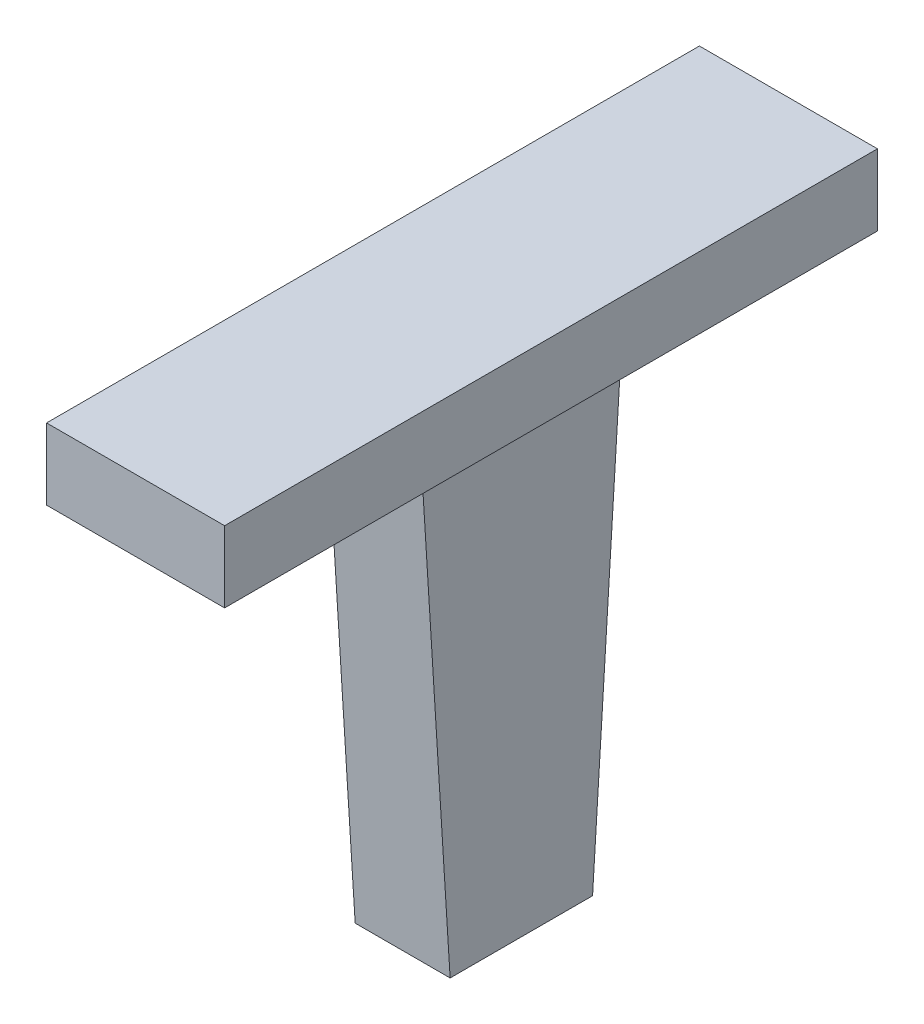
ISO-10303-21;
HEADER;
FILE_DESCRIPTION(('STEP AP214'),'2;1');
FILE_NAME('part.step','',(''),(''),'','','');
FILE_SCHEMA(('AUTOMOTIVE_DESIGN { 1 0 10303 214 1 1 1 1 }'));
ENDSEC;
DATA;
#1=APPLICATION_CONTEXT('core data for automotive mechanical design processes');
#2=APPLICATION_PROTOCOL_DEFINITION('international standard','automotive_design',2000,#1);
#3=PRODUCT_CONTEXT('',#1,'mechanical');
#4=PRODUCT('Part','Part','',(#3));
#5=PRODUCT_RELATED_PRODUCT_CATEGORY('part','',(#4));
#6=PRODUCT_DEFINITION_FORMATION('','',#4);
#7=PRODUCT_DEFINITION_CONTEXT('part definition',#1,'design');
#8=PRODUCT_DEFINITION('design','',#6,#7);
#9=PRODUCT_DEFINITION_SHAPE('','',#8);
#10=(LENGTH_UNIT() NAMED_UNIT(*) SI_UNIT(.MILLI.,.METRE.));
#11=(NAMED_UNIT(*) PLANE_ANGLE_UNIT() SI_UNIT($,.RADIAN.));
#12=(NAMED_UNIT(*) SI_UNIT($,.STERADIAN.) SOLID_ANGLE_UNIT());
#13=UNCERTAINTY_MEASURE_WITH_UNIT(LENGTH_MEASURE(1.E-05),#10,'distance_accuracy_value','');
#14=(GEOMETRIC_REPRESENTATION_CONTEXT(3) GLOBAL_UNCERTAINTY_ASSIGNED_CONTEXT((#13)) GLOBAL_UNIT_ASSIGNED_CONTEXT((#10,
#11,#12)) REPRESENTATION_CONTEXT('',''));
#15=CARTESIAN_POINT('',(0.,0.,0.));
#16=DIRECTION('',(0.,0.,1.));
#17=DIRECTION('',(1.,0.,0.));
#18=AXIS2_PLACEMENT_3D('',#15,#16,#17);
#19=CARTESIAN_POINT('',(40.,0.,0.));
#20=DIRECTION('',(1.,0.,0.));
#21=DIRECTION('',(0.,0.,-1.));
#22=AXIS2_PLACEMENT_3D('',#19,#20,#21);
#23=PLANE('',#22);
#24=DIRECTION('',(0.,0.998052578482889,-0.0623782861551805));
#25=VECTOR('',#24,1.);
#26=CARTESIAN_POINT('',(40.,0.,-30.));
#27=LINE('',#26,#25);
#28=CARTESIAN_POINT('',(40.,0.,-30.));
#29=VERTEX_POINT('',#28);
#30=CARTESIAN_POINT('',(40.,200.,-42.5));
#31=VERTEX_POINT('',#30);
#32=EDGE_CURVE('E77',#29,#31,#27,.T.);
#33=ORIENTED_EDGE('',*,*,#32,.T.);
#34=DIRECTION('',(0.,0.,1.));
#35=VECTOR('',#34,1.);
#36=CARTESIAN_POINT('',(40.,200.,0.));
#37=LINE('',#36,#35);
#38=CARTESIAN_POINT('',(40.,200.,42.5));
#39=VERTEX_POINT('',#38);
#40=EDGE_CURVE('E49',#31,#39,#37,.T.);
#41=ORIENTED_EDGE('',*,*,#40,.T.);
#42=DIRECTION('',(0.,-0.998052578482889,-0.0623782861551805));
#43=VECTOR('',#42,1.);
#44=CARTESIAN_POINT('',(40.,200.,42.5));
#45=LINE('',#44,#43);
#46=CARTESIAN_POINT('',(40.,0.,30.));
#47=VERTEX_POINT('',#46);
#48=EDGE_CURVE('E80',#39,#47,#45,.T.);
#49=ORIENTED_EDGE('',*,*,#48,.T.);
#50=DIRECTION('',(0.,0.,-1.));
#51=VECTOR('',#50,1.);
#52=CARTESIAN_POINT('',(40.,0.,30.));
#53=LINE('',#52,#51);
#54=EDGE_CURVE('E74',#47,#29,#53,.T.);
#55=ORIENTED_EDGE('',*,*,#54,.T.);
#56=EDGE_LOOP('',(#33,#41,#49,#55));
#57=FACE_BOUND('',#56,.T.);
#58=ADVANCED_FACE('F32',(#57),#23,.T.);
#59=CARTESIAN_POINT('',(0.,0.,0.));
#60=DIRECTION('',(1.,0.,0.));
#61=DIRECTION('',(0.,0.,-1.));
#62=AXIS2_PLACEMENT_3D('',#59,#60,#61);
#63=PLANE('',#62);
#64=DIRECTION('',(0.,0.,1.));
#65=VECTOR('',#64,1.);
#66=CARTESIAN_POINT('',(0.,200.,0.));
#67=LINE('',#66,#65);
#68=CARTESIAN_POINT('',(0.,200.,-42.5));
#69=VERTEX_POINT('',#68);
#70=CARTESIAN_POINT('',(0.,200.,42.5));
#71=VERTEX_POINT('',#70);
#72=EDGE_CURVE('E11',#69,#71,#67,.T.);
#73=ORIENTED_EDGE('',*,*,#72,.F.);
#74=DIRECTION('',(0.,0.998052578482889,-0.0623782861551805));
#75=VECTOR('',#74,1.);
#76=CARTESIAN_POINT('',(0.,0.,-30.));
#77=LINE('',#76,#75);
#78=CARTESIAN_POINT('',(0.,0.,-30.));
#79=VERTEX_POINT('',#78);
#80=EDGE_CURVE('E103',#79,#69,#77,.T.);
#81=ORIENTED_EDGE('',*,*,#80,.F.);
#82=DIRECTION('',(0.,0.,-1.));
#83=VECTOR('',#82,1.);
#84=CARTESIAN_POINT('',(0.,0.,30.));
#85=LINE('',#84,#83);
#86=CARTESIAN_POINT('',(0.,0.,30.));
#87=VERTEX_POINT('',#86);
#88=EDGE_CURVE('E61',#87,#79,#85,.T.);
#89=ORIENTED_EDGE('',*,*,#88,.F.);
#90=DIRECTION('',(0.,-0.998052578482889,-0.0623782861551805));
#91=VECTOR('',#90,1.);
#92=CARTESIAN_POINT('',(0.,200.,42.5));
#93=LINE('',#92,#91);
#94=EDGE_CURVE('E99',#71,#87,#93,.T.);
#95=ORIENTED_EDGE('',*,*,#94,.F.);
#96=EDGE_LOOP('',(#73,#81,#89,#95));
#97=FACE_BOUND('',#96,.T.);
#98=ADVANCED_FACE('F117',(#97),#63,.F.);
#99=CARTESIAN_POINT('',(40.,200.,42.5));
#100=DIRECTION('',(0.,0.0623782861551806,-0.998052578482888));
#101=DIRECTION('',(0.,0.998052578482889,0.0623782861551806));
#102=AXIS2_PLACEMENT_3D('',#99,#100,#101);
#103=PLANE('',#102);
#104=ORIENTED_EDGE('',*,*,#94,.T.);
#105=DIRECTION('',(-1.,0.,0.));
#106=VECTOR('',#105,1.);
#107=CARTESIAN_POINT('',(40.,0.,30.));
#108=LINE('',#107,#106);
#109=EDGE_CURVE('E41',#47,#87,#108,.T.);
#110=ORIENTED_EDGE('',*,*,#109,.F.);
#111=ORIENTED_EDGE('',*,*,#48,.F.);
#112=DIRECTION('',(-1.,0.,0.));
#113=VECTOR('',#112,1.);
#114=CARTESIAN_POINT('',(40.,200.,42.5));
#115=LINE('',#114,#113);
#116=EDGE_CURVE('E92',#39,#71,#115,.T.);
#117=ORIENTED_EDGE('',*,*,#116,.T.);
#118=EDGE_LOOP('',(#104,#110,#111,#117));
#119=FACE_BOUND('',#118,.T.);
#120=ADVANCED_FACE('F34',(#119),#103,.F.);
#121=CARTESIAN_POINT('',(40.,0.,30.));
#122=DIRECTION('',(0.,1.,0.));
#123=DIRECTION('',(0.,0.,1.));
#124=AXIS2_PLACEMENT_3D('',#121,#122,#123);
#125=PLANE('',#124);
#126=CARTESIAN_POINT('',(20.,0.,10.));
#127=DIRECTION('',(0.,1.,0.));
#128=DIRECTION('',(0.,0.,1.));
#129=AXIS2_PLACEMENT_3D('',#126,#127,#128);
#130=CIRCLE('',#129,3.5);
#131=CARTESIAN_POINT('',(20.,0.,13.5));
#132=VERTEX_POINT('',#131);
#133=EDGE_CURVE('E152',#132,#132,#130,.T.);
#134=ORIENTED_EDGE('',*,*,#133,.T.);
#135=EDGE_LOOP('',(#134));
#136=FACE_BOUND('',#135,.T.);
#137=CARTESIAN_POINT('',(20.,0.,-10.));
#138=DIRECTION('',(0.,1.,0.));
#139=DIRECTION('',(0.,0.,1.));
#140=AXIS2_PLACEMENT_3D('',#137,#138,#139);
#141=CIRCLE('',#140,3.5);
#142=CARTESIAN_POINT('',(20.,0.,-6.5));
#143=VERTEX_POINT('',#142);
#144=EDGE_CURVE('E155',#143,#143,#141,.T.);
#145=ORIENTED_EDGE('',*,*,#144,.T.);
#146=EDGE_LOOP('',(#145));
#147=FACE_BOUND('',#146,.T.);
#148=ORIENTED_EDGE('',*,*,#88,.T.);
#149=DIRECTION('',(-1.,0.,0.));
#150=VECTOR('',#149,1.);
#151=CARTESIAN_POINT('',(40.,0.,-30.));
#152=LINE('',#151,#150);
#153=EDGE_CURVE('E85',#29,#79,#152,.T.);
#154=ORIENTED_EDGE('',*,*,#153,.F.);
#155=ORIENTED_EDGE('',*,*,#54,.F.);
#156=ORIENTED_EDGE('',*,*,#109,.T.);
#157=EDGE_LOOP('',(#148,#154,#155,#156));
#158=FACE_BOUND('',#157,.T.);
#159=ADVANCED_FACE('F86',(#136,#147,#158),#125,.F.);
#160=CARTESIAN_POINT('',(40.,0.,-30.));
#161=DIRECTION('',(0.,0.0623782861551806,0.998052578482888));
#162=DIRECTION('',(0.,-0.998052578482889,0.0623782861551806));
#163=AXIS2_PLACEMENT_3D('',#160,#161,#162);
#164=PLANE('',#163);
#165=ORIENTED_EDGE('',*,*,#80,.T.);
#166=DIRECTION('',(-1.,0.,0.));
#167=VECTOR('',#166,1.);
#168=CARTESIAN_POINT('',(40.,200.,-42.5));
#169=LINE('',#168,#167);
#170=EDGE_CURVE('E88',#31,#69,#169,.T.);
#171=ORIENTED_EDGE('',*,*,#170,.F.);
#172=ORIENTED_EDGE('',*,*,#32,.F.);
#173=ORIENTED_EDGE('',*,*,#153,.T.);
#174=EDGE_LOOP('',(#165,#171,#172,#173));
#175=FACE_BOUND('',#174,.T.);
#176=ADVANCED_FACE('F90',(#175),#164,.F.);
#177=CARTESIAN_POINT('',(40.,200.,-132.5));
#178=DIRECTION('',(0.,0.,1.));
#179=DIRECTION('',(1.,0.,0.));
#180=AXIS2_PLACEMENT_3D('',#177,#178,#179);
#181=PLANE('',#180);
#182=DIRECTION('',(-1.,0.,0.));
#183=VECTOR('',#182,1.);
#184=CARTESIAN_POINT('',(40.,200.,-132.5));
#185=LINE('',#184,#183);
#186=CARTESIAN_POINT('',(57.5,200.,-132.5));
#187=VERTEX_POINT('',#186);
#188=CARTESIAN_POINT('',(-17.5,200.,-132.5));
#189=VERTEX_POINT('',#188);
#190=EDGE_CURVE('E113',#187,#189,#185,.T.);
#191=ORIENTED_EDGE('',*,*,#190,.T.);
#192=DIRECTION('',(0.,1.,0.));
#193=VECTOR('',#192,1.);
#194=CARTESIAN_POINT('',(-17.5,230.,-132.5));
#195=LINE('',#194,#193);
#196=CARTESIAN_POINT('',(-17.5,230.,-132.5));
#197=VERTEX_POINT('',#196);
#198=EDGE_CURVE('E183',#189,#197,#195,.T.);
#199=ORIENTED_EDGE('',*,*,#198,.T.);
#200=DIRECTION('',(-1.,0.,0.));
#201=VECTOR('',#200,1.);
#202=CARTESIAN_POINT('',(40.,230.,-132.5));
#203=LINE('',#202,#201);
#204=CARTESIAN_POINT('',(57.5,230.,-132.5));
#205=VERTEX_POINT('',#204);
#206=EDGE_CURVE('E110',#205,#197,#203,.T.);
#207=ORIENTED_EDGE('',*,*,#206,.F.);
#208=DIRECTION('',(0.,1.,0.));
#209=VECTOR('',#208,1.);
#210=CARTESIAN_POINT('',(57.5,230.,-132.5));
#211=LINE('',#210,#209);
#212=EDGE_CURVE('E170',#187,#205,#211,.T.);
#213=ORIENTED_EDGE('',*,*,#212,.F.);
#214=EDGE_LOOP('',(#191,#199,#207,#213));
#215=FACE_BOUND('',#214,.T.);
#216=ADVANCED_FACE('F139',(#215),#181,.F.);
#217=CARTESIAN_POINT('',(40.,230.,-132.5));
#218=DIRECTION('',(0.,-1.,0.));
#219=DIRECTION('',(0.,0.,-1.));
#220=AXIS2_PLACEMENT_3D('',#217,#218,#219);
#221=PLANE('',#220);
#222=ORIENTED_EDGE('',*,*,#206,.T.);
#223=DIRECTION('',(0.,0.,1.));
#224=VECTOR('',#223,1.);
#225=CARTESIAN_POINT('',(-17.5,230.,142.5));
#226=LINE('',#225,#224);
#227=CARTESIAN_POINT('',(-17.5,230.,142.5));
#228=VERTEX_POINT('',#227);
#229=EDGE_CURVE('E167',#197,#228,#226,.T.);
#230=ORIENTED_EDGE('',*,*,#229,.T.);
#231=DIRECTION('',(-1.,0.,0.));
#232=VECTOR('',#231,1.);
#233=CARTESIAN_POINT('',(40.,230.,142.5));
#234=LINE('',#233,#232);
#235=CARTESIAN_POINT('',(57.5,230.,142.5));
#236=VERTEX_POINT('',#235);
#237=EDGE_CURVE('E107',#236,#228,#234,.T.);
#238=ORIENTED_EDGE('',*,*,#237,.F.);
#239=DIRECTION('',(0.,0.,1.));
#240=VECTOR('',#239,1.);
#241=CARTESIAN_POINT('',(57.5,230.,142.5));
#242=LINE('',#241,#240);
#243=EDGE_CURVE('E173',#205,#236,#242,.T.);
#244=ORIENTED_EDGE('',*,*,#243,.F.);
#245=EDGE_LOOP('',(#222,#230,#238,#244));
#246=FACE_BOUND('',#245,.T.);
#247=ADVANCED_FACE('F135',(#246),#221,.F.);
#248=CARTESIAN_POINT('',(40.,230.,142.5));
#249=DIRECTION('',(0.,0.,-1.));
#250=DIRECTION('',(0.,1.,0.));
#251=AXIS2_PLACEMENT_3D('',#248,#249,#250);
#252=PLANE('',#251);
#253=ORIENTED_EDGE('',*,*,#237,.T.);
#254=DIRECTION('',(0.,-1.,0.));
#255=VECTOR('',#254,1.);
#256=CARTESIAN_POINT('',(-17.5,230.,142.5));
#257=LINE('',#256,#255);
#258=CARTESIAN_POINT('',(-17.5,200.,142.5));
#259=VERTEX_POINT('',#258);
#260=EDGE_CURVE('E176',#228,#259,#257,.T.);
#261=ORIENTED_EDGE('',*,*,#260,.T.);
#262=DIRECTION('',(-1.,0.,0.));
#263=VECTOR('',#262,1.);
#264=CARTESIAN_POINT('',(40.,200.,142.5));
#265=LINE('',#264,#263);
#266=CARTESIAN_POINT('',(57.5,200.,142.5));
#267=VERTEX_POINT('',#266);
#268=EDGE_CURVE('E95',#267,#259,#265,.T.);
#269=ORIENTED_EDGE('',*,*,#268,.F.);
#270=DIRECTION('',(0.,-1.,0.));
#271=VECTOR('',#270,1.);
#272=CARTESIAN_POINT('',(57.5,230.,142.5));
#273=LINE('',#272,#271);
#274=EDGE_CURVE('E163',#236,#267,#273,.T.);
#275=ORIENTED_EDGE('',*,*,#274,.F.);
#276=EDGE_LOOP('',(#253,#261,#269,#275));
#277=FACE_BOUND('',#276,.T.);
#278=ADVANCED_FACE('F131',(#277),#252,.F.);
#279=CARTESIAN_POINT('',(40.,200.,142.5));
#280=DIRECTION('',(0.,1.,0.));
#281=DIRECTION('',(0.,0.,1.));
#282=AXIS2_PLACEMENT_3D('',#279,#280,#281);
#283=PLANE('',#282);
#284=ORIENTED_EDGE('',*,*,#190,.F.);
#285=DIRECTION('',(0.,0.,-1.));
#286=VECTOR('',#285,1.);
#287=CARTESIAN_POINT('',(57.5,200.,142.5));
#288=LINE('',#287,#286);
#289=EDGE_CURVE('E166',#267,#187,#288,.T.);
#290=ORIENTED_EDGE('',*,*,#289,.F.);
#291=ORIENTED_EDGE('',*,*,#268,.T.);
#292=DIRECTION('',(0.,0.,-1.));
#293=VECTOR('',#292,1.);
#294=CARTESIAN_POINT('',(-17.5,200.,142.5));
#295=LINE('',#294,#293);
#296=EDGE_CURVE('E179',#259,#189,#295,.T.);
#297=ORIENTED_EDGE('',*,*,#296,.T.);
#298=EDGE_LOOP('',(#284,#290,#291,#297));
#299=FACE_BOUND('',#298,.T.);
#300=ORIENTED_EDGE('',*,*,#40,.F.);
#301=ORIENTED_EDGE('',*,*,#170,.T.);
#302=ORIENTED_EDGE('',*,*,#72,.T.);
#303=ORIENTED_EDGE('',*,*,#116,.F.);
#304=EDGE_LOOP('',(#300,#301,#302,#303));
#305=FACE_BOUND('',#304,.T.);
#306=ADVANCED_FACE('F127',(#299,#305),#283,.F.);
#307=CARTESIAN_POINT('',(-17.5,0.,0.));
#308=DIRECTION('',(1.,0.,0.));
#309=DIRECTION('',(0.,0.,-1.));
#310=AXIS2_PLACEMENT_3D('',#307,#308,#309);
#311=PLANE('',#310);
#312=ORIENTED_EDGE('',*,*,#260,.F.);
#313=ORIENTED_EDGE('',*,*,#229,.F.);
#314=ORIENTED_EDGE('',*,*,#198,.F.);
#315=ORIENTED_EDGE('',*,*,#296,.F.);
#316=EDGE_LOOP('',(#312,#313,#314,#315));
#317=FACE_BOUND('',#316,.T.);
#318=ADVANCED_FACE('F130',(#317),#311,.F.);
#319=CARTESIAN_POINT('',(57.5,0.,0.));
#320=DIRECTION('',(1.,0.,0.));
#321=DIRECTION('',(0.,0.,-1.));
#322=AXIS2_PLACEMENT_3D('',#319,#320,#321);
#323=PLANE('',#322);
#324=ORIENTED_EDGE('',*,*,#274,.T.);
#325=ORIENTED_EDGE('',*,*,#289,.T.);
#326=ORIENTED_EDGE('',*,*,#212,.T.);
#327=ORIENTED_EDGE('',*,*,#243,.T.);
#328=EDGE_LOOP('',(#324,#325,#326,#327));
#329=FACE_BOUND('',#328,.T.);
#330=ADVANCED_FACE('F217',(#329),#323,.T.);
#331=CARTESIAN_POINT('',(20.,10.,-10.));
#332=DIRECTION('',(0.,-1.,0.));
#333=DIRECTION('',(0.,0.,-1.));
#334=AXIS2_PLACEMENT_3D('',#331,#332,#333);
#335=CYLINDRICAL_SURFACE('',#334,3.5);
#336=CARTESIAN_POINT('',(20.,10.,-10.));
#337=DIRECTION('',(0.,1.,0.));
#338=DIRECTION('',(0.,0.,1.));
#339=AXIS2_PLACEMENT_3D('',#336,#337,#338);
#340=CIRCLE('',#339,3.5);
#341=CARTESIAN_POINT('',(20.,10.,-6.5));
#342=VERTEX_POINT('',#341);
#343=EDGE_CURVE('E157',#342,#342,#340,.T.);
#344=ORIENTED_EDGE('',*,*,#343,.T.);
#345=EDGE_LOOP('',(#344));
#346=FACE_BOUND('',#345,.T.);
#347=ORIENTED_EDGE('',*,*,#144,.F.);
#348=EDGE_LOOP('',(#347));
#349=FACE_BOUND('',#348,.T.);
#350=ADVANCED_FACE('F219',(#346,#349),#335,.F.);
#351=CARTESIAN_POINT('',(20.,10.,-10.));
#352=DIRECTION('',(0.,1.,0.));
#353=DIRECTION('',(0.,0.,1.));
#354=AXIS2_PLACEMENT_3D('',#351,#352,#353);
#355=PLANE('',#354);
#356=ORIENTED_EDGE('',*,*,#343,.F.);
#357=EDGE_LOOP('',(#356));
#358=FACE_BOUND('',#357,.T.);
#359=ADVANCED_FACE('F225',(#358),#355,.F.);
#360=CARTESIAN_POINT('',(20.,10.,10.));
#361=DIRECTION('',(0.,-1.,0.));
#362=DIRECTION('',(0.,0.,-1.));
#363=AXIS2_PLACEMENT_3D('',#360,#361,#362);
#364=CYLINDRICAL_SURFACE('',#363,3.5);
#365=CARTESIAN_POINT('',(20.,10.,10.));
#366=DIRECTION('',(0.,1.,0.));
#367=DIRECTION('',(0.,0.,1.));
#368=AXIS2_PLACEMENT_3D('',#365,#366,#367);
#369=CIRCLE('',#368,3.5);
#370=CARTESIAN_POINT('',(20.,10.,13.5));
#371=VERTEX_POINT('',#370);
#372=EDGE_CURVE('E180',#371,#371,#369,.T.);
#373=ORIENTED_EDGE('',*,*,#372,.T.);
#374=EDGE_LOOP('',(#373));
#375=FACE_BOUND('',#374,.T.);
#376=ORIENTED_EDGE('',*,*,#133,.F.);
#377=EDGE_LOOP('',(#376));
#378=FACE_BOUND('',#377,.T.);
#379=ADVANCED_FACE('F231',(#375,#378),#364,.F.);
#380=CARTESIAN_POINT('',(20.,10.,10.));
#381=DIRECTION('',(0.,1.,0.));
#382=DIRECTION('',(0.,0.,1.));
#383=AXIS2_PLACEMENT_3D('',#380,#381,#382);
#384=PLANE('',#383);
#385=ORIENTED_EDGE('',*,*,#372,.F.);
#386=EDGE_LOOP('',(#385));
#387=FACE_BOUND('',#386,.T.);
#388=ADVANCED_FACE('F235',(#387),#384,.F.);
#389=CLOSED_SHELL('',(#58,#98,#120,#159,#176,#216,#247,#278,#306,#318,#330,#350,#359,#379,#388));
#390=MANIFOLD_SOLID_BREP('B2',#389);
#391=ADVANCED_BREP_SHAPE_REPRESENTATION('',(#18,#390),#14);
#392=SHAPE_DEFINITION_REPRESENTATION(#9,#391);
ENDSEC;
END-ISO-10303-21;
